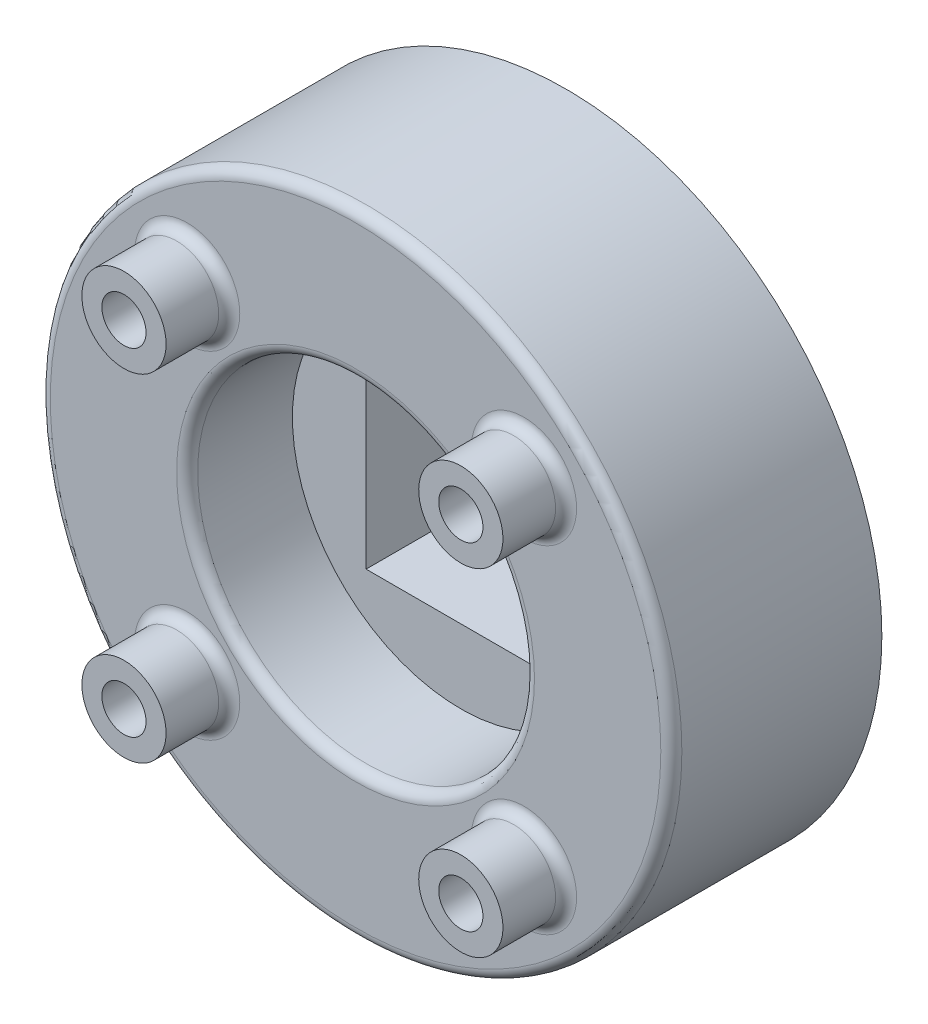
ISO-10303-21;
HEADER;
FILE_DESCRIPTION(('STEP AP214'),'2;1');
FILE_NAME('part.step','',(''),(''),'','','');
FILE_SCHEMA(('AUTOMOTIVE_DESIGN { 1 0 10303 214 1 1 1 1 }'));
ENDSEC;
DATA;
#1=APPLICATION_CONTEXT('core data for automotive mechanical design processes');
#2=APPLICATION_PROTOCOL_DEFINITION('international standard','automotive_design',2000,#1);
#3=PRODUCT_CONTEXT('',#1,'mechanical');
#4=PRODUCT('Part','Part','',(#3));
#5=PRODUCT_RELATED_PRODUCT_CATEGORY('part','',(#4));
#6=PRODUCT_DEFINITION_FORMATION('','',#4);
#7=PRODUCT_DEFINITION_CONTEXT('part definition',#1,'design');
#8=PRODUCT_DEFINITION('design','',#6,#7);
#9=PRODUCT_DEFINITION_SHAPE('','',#8);
#10=(LENGTH_UNIT() NAMED_UNIT(*) SI_UNIT(.MILLI.,.METRE.));
#11=(NAMED_UNIT(*) PLANE_ANGLE_UNIT() SI_UNIT($,.RADIAN.));
#12=(NAMED_UNIT(*) SI_UNIT($,.STERADIAN.) SOLID_ANGLE_UNIT());
#13=UNCERTAINTY_MEASURE_WITH_UNIT(LENGTH_MEASURE(1.E-05),#10,'distance_accuracy_value','');
#14=(GEOMETRIC_REPRESENTATION_CONTEXT(3) GLOBAL_UNCERTAINTY_ASSIGNED_CONTEXT((#13)) GLOBAL_UNIT_ASSIGNED_CONTEXT((#10,
#11,#12)) REPRESENTATION_CONTEXT('',''));
#15=CARTESIAN_POINT('',(0.,0.,0.));
#16=DIRECTION('',(0.,0.,1.));
#17=DIRECTION('',(1.,0.,0.));
#18=AXIS2_PLACEMENT_3D('',#15,#16,#17);
#19=CARTESIAN_POINT('',(0.,0.,50.));
#20=DIRECTION('',(0.,0.,-1.));
#21=DIRECTION('',(-1.,0.,0.));
#22=AXIS2_PLACEMENT_3D('',#19,#20,#21);
#23=CYLINDRICAL_SURFACE('',#22,75.);
#24=CARTESIAN_POINT('',(0.,0.,47.5));
#25=DIRECTION('',(0.,0.,1.));
#26=DIRECTION('',(1.,0.,0.));
#27=AXIS2_PLACEMENT_3D('',#24,#25,#26);
#28=CIRCLE('',#27,75.);
#29=CARTESIAN_POINT('',(75.,0.,47.5));
#30=VERTEX_POINT('',#29);
#31=EDGE_CURVE('E11',#30,#30,#28,.F.);
#32=ORIENTED_EDGE('',*,*,#31,.T.);
#33=EDGE_LOOP('',(#32));
#34=FACE_BOUND('',#33,.T.);
#35=CARTESIAN_POINT('',(0.,0.,0.));
#36=DIRECTION('',(0.,0.,1.));
#37=DIRECTION('',(1.,0.,0.));
#38=AXIS2_PLACEMENT_3D('',#35,#36,#37);
#39=CIRCLE('',#38,75.);
#40=CARTESIAN_POINT('',(75.,0.,0.));
#41=VERTEX_POINT('',#40);
#42=EDGE_CURVE('E162',#41,#41,#39,.T.);
#43=ORIENTED_EDGE('',*,*,#42,.T.);
#44=EDGE_LOOP('',(#43));
#45=FACE_BOUND('',#44,.T.);
#46=ADVANCED_FACE('F36',(#34,#45),#23,.T.);
#47=CARTESIAN_POINT('',(0.,0.,50.));
#48=DIRECTION('',(0.,0.,1.));
#49=DIRECTION('',(1.,0.,0.));
#50=AXIS2_PLACEMENT_3D('',#47,#48,#49);
#51=PLANE('',#50);
#52=CARTESIAN_POINT('',(0.,0.,50.));
#53=DIRECTION('',(0.,0.,1.));
#54=DIRECTION('',(1.,0.,0.));
#55=AXIS2_PLACEMENT_3D('',#52,#53,#54);
#56=CIRCLE('',#55,42.5);
#57=CARTESIAN_POINT('',(42.5,0.,50.));
#58=VERTEX_POINT('',#57);
#59=EDGE_CURVE('E44',#58,#58,#56,.F.);
#60=ORIENTED_EDGE('',*,*,#59,.T.);
#61=EDGE_LOOP('',(#60));
#62=FACE_BOUND('',#61,.T.);
#63=CARTESIAN_POINT('',(0.,0.,50.));
#64=DIRECTION('',(0.,0.,1.));
#65=DIRECTION('',(1.,0.,0.));
#66=AXIS2_PLACEMENT_3D('',#63,#64,#65);
#67=CIRCLE('',#66,72.5);
#68=CARTESIAN_POINT('',(72.5,0.,50.));
#69=VERTEX_POINT('',#68);
#70=EDGE_CURVE('E192',#69,#69,#67,.T.);
#71=ORIENTED_EDGE('',*,*,#70,.T.);
#72=EDGE_LOOP('',(#71));
#73=FACE_BOUND('',#72,.T.);
#74=CARTESIAN_POINT('',(39.9999999999996,40.0000000000004,50.));
#75=DIRECTION('',(0.,0.,1.));
#76=DIRECTION('',(1.,0.,0.));
#77=AXIS2_PLACEMENT_3D('',#74,#75,#76);
#78=CIRCLE('',#77,12.5);
#79=CARTESIAN_POINT('',(52.4999999999996,40.0000000000004,50.));
#80=VERTEX_POINT('',#79);
#81=EDGE_CURVE('E186',#80,#80,#78,.F.);
#82=ORIENTED_EDGE('',*,*,#81,.T.);
#83=EDGE_LOOP('',(#82));
#84=FACE_BOUND('',#83,.T.);
#85=CARTESIAN_POINT('',(40.,-40.,50.));
#86=DIRECTION('',(0.,0.,1.));
#87=DIRECTION('',(1.,0.,0.));
#88=AXIS2_PLACEMENT_3D('',#85,#86,#87);
#89=CIRCLE('',#88,12.5);
#90=CARTESIAN_POINT('',(52.5,-40.,50.));
#91=VERTEX_POINT('',#90);
#92=EDGE_CURVE('E180',#91,#91,#89,.F.);
#93=ORIENTED_EDGE('',*,*,#92,.T.);
#94=EDGE_LOOP('',(#93));
#95=FACE_BOUND('',#94,.T.);
#96=CARTESIAN_POINT('',(-39.9999999999999,-40.0000000000001,50.));
#97=DIRECTION('',(0.,0.,1.));
#98=DIRECTION('',(1.,0.,0.));
#99=AXIS2_PLACEMENT_3D('',#96,#97,#98);
#100=CIRCLE('',#99,12.5);
#101=CARTESIAN_POINT('',(-27.4999999999999,-40.0000000000001,50.));
#102=VERTEX_POINT('',#101);
#103=EDGE_CURVE('E174',#102,#102,#100,.F.);
#104=ORIENTED_EDGE('',*,*,#103,.T.);
#105=EDGE_LOOP('',(#104));
#106=FACE_BOUND('',#105,.T.);
#107=CARTESIAN_POINT('',(-40.,40.,50.));
#108=DIRECTION('',(0.,0.,1.));
#109=DIRECTION('',(1.,0.,0.));
#110=AXIS2_PLACEMENT_3D('',#107,#108,#109);
#111=CIRCLE('',#110,12.5);
#112=CARTESIAN_POINT('',(-27.5,40.,50.));
#113=VERTEX_POINT('',#112);
#114=EDGE_CURVE('E168',#113,#113,#111,.F.);
#115=ORIENTED_EDGE('',*,*,#114,.T.);
#116=EDGE_LOOP('',(#115));
#117=FACE_BOUND('',#116,.T.);
#118=ADVANCED_FACE('F197',(#62,#73,#84,#95,#106,#117),#51,.T.);
#119=CARTESIAN_POINT('',(0.,0.,0.));
#120=DIRECTION('',(0.,0.,1.));
#121=DIRECTION('',(1.,0.,0.));
#122=AXIS2_PLACEMENT_3D('',#119,#120,#121);
#123=PLANE('',#122);
#124=DIRECTION('',(-1.,0.,0.));
#125=VECTOR('',#124,1.);
#126=CARTESIAN_POINT('',(22.5,22.5,0.));
#127=LINE('',#126,#125);
#128=CARTESIAN_POINT('',(22.5,22.5,0.));
#129=VERTEX_POINT('',#128);
#130=CARTESIAN_POINT('',(-22.5,22.5,0.));
#131=VERTEX_POINT('',#130);
#132=EDGE_CURVE('E140',#129,#131,#127,.T.);
#133=ORIENTED_EDGE('',*,*,#132,.T.);
#134=DIRECTION('',(0.,-1.,0.));
#135=VECTOR('',#134,1.);
#136=CARTESIAN_POINT('',(-22.5,-22.5,0.));
#137=LINE('',#136,#135);
#138=CARTESIAN_POINT('',(-22.5,-22.5,0.));
#139=VERTEX_POINT('',#138);
#140=EDGE_CURVE('E132',#131,#139,#137,.T.);
#141=ORIENTED_EDGE('',*,*,#140,.T.);
#142=DIRECTION('',(1.,0.,0.));
#143=VECTOR('',#142,1.);
#144=CARTESIAN_POINT('',(22.5,-22.5,0.));
#145=LINE('',#144,#143);
#146=CARTESIAN_POINT('',(22.5,-22.5,0.));
#147=VERTEX_POINT('',#146);
#148=EDGE_CURVE('E135',#139,#147,#145,.T.);
#149=ORIENTED_EDGE('',*,*,#148,.T.);
#150=DIRECTION('',(0.,1.,0.));
#151=VECTOR('',#150,1.);
#152=CARTESIAN_POINT('',(22.5,-22.5,0.));
#153=LINE('',#152,#151);
#154=EDGE_CURVE('E56',#147,#129,#153,.T.);
#155=ORIENTED_EDGE('',*,*,#154,.T.);
#156=EDGE_LOOP('',(#133,#141,#149,#155));
#157=FACE_BOUND('',#156,.T.);
#158=ORIENTED_EDGE('',*,*,#42,.F.);
#159=EDGE_LOOP('',(#158));
#160=FACE_BOUND('',#159,.T.);
#161=ADVANCED_FACE('F209',(#157,#160),#123,.F.);
#162=CARTESIAN_POINT('',(0.,0.,25.));
#163=DIRECTION('',(0.,0.,1.));
#164=DIRECTION('',(1.,0.,0.));
#165=AXIS2_PLACEMENT_3D('',#162,#163,#164);
#166=CYLINDRICAL_SURFACE('',#165,40.);
#167=CARTESIAN_POINT('',(0.,0.,47.5));
#168=DIRECTION('',(0.,0.,1.));
#169=DIRECTION('',(1.,0.,0.));
#170=AXIS2_PLACEMENT_3D('',#167,#168,#169);
#171=CIRCLE('',#170,40.);
#172=CARTESIAN_POINT('',(40.,0.,47.5));
#173=VERTEX_POINT('',#172);
#174=EDGE_CURVE('E189',#173,#173,#171,.T.);
#175=ORIENTED_EDGE('',*,*,#174,.T.);
#176=EDGE_LOOP('',(#175));
#177=FACE_BOUND('',#176,.T.);
#178=CARTESIAN_POINT('',(0.,0.,25.));
#179=DIRECTION('',(0.,0.,1.));
#180=DIRECTION('',(1.,0.,0.));
#181=AXIS2_PLACEMENT_3D('',#178,#179,#180);
#182=CIRCLE('',#181,40.);
#183=CARTESIAN_POINT('',(40.,0.,25.));
#184=VERTEX_POINT('',#183);
#185=EDGE_CURVE('E154',#184,#184,#182,.T.);
#186=ORIENTED_EDGE('',*,*,#185,.F.);
#187=EDGE_LOOP('',(#186));
#188=FACE_BOUND('',#187,.T.);
#189=ADVANCED_FACE('F205',(#177,#188),#166,.F.);
#190=CARTESIAN_POINT('',(0.,0.,25.));
#191=DIRECTION('',(0.,0.,1.));
#192=DIRECTION('',(1.,0.,0.));
#193=AXIS2_PLACEMENT_3D('',#190,#191,#192);
#194=PLANE('',#193);
#195=DIRECTION('',(0.,-1.,0.));
#196=VECTOR('',#195,1.);
#197=CARTESIAN_POINT('',(-22.5,-22.5,25.));
#198=LINE('',#197,#196);
#199=CARTESIAN_POINT('',(-22.5,22.5,25.));
#200=VERTEX_POINT('',#199);
#201=CARTESIAN_POINT('',(-22.5,-22.5,25.));
#202=VERTEX_POINT('',#201);
#203=EDGE_CURVE('E131',#200,#202,#198,.T.);
#204=ORIENTED_EDGE('',*,*,#203,.F.);
#205=DIRECTION('',(-1.,0.,0.));
#206=VECTOR('',#205,1.);
#207=CARTESIAN_POINT('',(22.5,22.5,25.));
#208=LINE('',#207,#206);
#209=CARTESIAN_POINT('',(22.5,22.5,25.));
#210=VERTEX_POINT('',#209);
#211=EDGE_CURVE('E136',#210,#200,#208,.T.);
#212=ORIENTED_EDGE('',*,*,#211,.F.);
#213=DIRECTION('',(0.,1.,0.));
#214=VECTOR('',#213,1.);
#215=CARTESIAN_POINT('',(22.5,-22.5,25.));
#216=LINE('',#215,#214);
#217=CARTESIAN_POINT('',(22.5,-22.5,25.));
#218=VERTEX_POINT('',#217);
#219=EDGE_CURVE('E51',#218,#210,#216,.T.);
#220=ORIENTED_EDGE('',*,*,#219,.F.);
#221=DIRECTION('',(1.,0.,0.));
#222=VECTOR('',#221,1.);
#223=CARTESIAN_POINT('',(22.5,-22.5,25.));
#224=LINE('',#223,#222);
#225=EDGE_CURVE('E146',#202,#218,#224,.T.);
#226=ORIENTED_EDGE('',*,*,#225,.F.);
#227=EDGE_LOOP('',(#204,#212,#220,#226));
#228=FACE_BOUND('',#227,.T.);
#229=ORIENTED_EDGE('',*,*,#185,.T.);
#230=EDGE_LOOP('',(#229));
#231=FACE_BOUND('',#230,.T.);
#232=ADVANCED_FACE('F208',(#228,#231),#194,.T.);
#233=CARTESIAN_POINT('',(-22.5,-22.5,0.));
#234=DIRECTION('',(-1.,0.,0.));
#235=DIRECTION('',(0.,0.,1.));
#236=AXIS2_PLACEMENT_3D('',#233,#234,#235);
#237=PLANE('',#236);
#238=ORIENTED_EDGE('',*,*,#203,.T.);
#239=DIRECTION('',(0.,0.,1.));
#240=VECTOR('',#239,1.);
#241=CARTESIAN_POINT('',(-22.5,-22.5,0.));
#242=LINE('',#241,#240);
#243=EDGE_CURVE('E143',#139,#202,#242,.T.);
#244=ORIENTED_EDGE('',*,*,#243,.F.);
#245=ORIENTED_EDGE('',*,*,#140,.F.);
#246=DIRECTION('',(0.,0.,1.));
#247=VECTOR('',#246,1.);
#248=CARTESIAN_POINT('',(-22.5,22.5,0.));
#249=LINE('',#248,#247);
#250=EDGE_CURVE('E152',#131,#200,#249,.T.);
#251=ORIENTED_EDGE('',*,*,#250,.T.);
#252=EDGE_LOOP('',(#238,#244,#245,#251));
#253=FACE_BOUND('',#252,.T.);
#254=ADVANCED_FACE('F214',(#253),#237,.F.);
#255=CARTESIAN_POINT('',(22.5,22.5,0.));
#256=DIRECTION('',(0.,1.,0.));
#257=DIRECTION('',(-1.,0.,0.));
#258=AXIS2_PLACEMENT_3D('',#255,#256,#257);
#259=PLANE('',#258);
#260=ORIENTED_EDGE('',*,*,#211,.T.);
#261=ORIENTED_EDGE('',*,*,#250,.F.);
#262=ORIENTED_EDGE('',*,*,#132,.F.);
#263=DIRECTION('',(0.,0.,1.));
#264=VECTOR('',#263,1.);
#265=CARTESIAN_POINT('',(22.5,22.5,0.));
#266=LINE('',#265,#264);
#267=EDGE_CURVE('E155',#129,#210,#266,.T.);
#268=ORIENTED_EDGE('',*,*,#267,.T.);
#269=EDGE_LOOP('',(#260,#261,#262,#268));
#270=FACE_BOUND('',#269,.T.);
#271=ADVANCED_FACE('F220',(#270),#259,.F.);
#272=CARTESIAN_POINT('',(22.5,-22.5,0.));
#273=DIRECTION('',(1.,0.,0.));
#274=DIRECTION('',(0.,0.,-1.));
#275=AXIS2_PLACEMENT_3D('',#272,#273,#274);
#276=PLANE('',#275);
#277=ORIENTED_EDGE('',*,*,#219,.T.);
#278=ORIENTED_EDGE('',*,*,#267,.F.);
#279=ORIENTED_EDGE('',*,*,#154,.F.);
#280=DIRECTION('',(0.,0.,1.));
#281=VECTOR('',#280,1.);
#282=CARTESIAN_POINT('',(22.5,-22.5,0.));
#283=LINE('',#282,#281);
#284=EDGE_CURVE('E157',#147,#218,#283,.T.);
#285=ORIENTED_EDGE('',*,*,#284,.T.);
#286=EDGE_LOOP('',(#277,#278,#279,#285));
#287=FACE_BOUND('',#286,.T.);
#288=ADVANCED_FACE('F310',(#287),#276,.F.);
#289=CARTESIAN_POINT('',(22.5,-22.5,0.));
#290=DIRECTION('',(0.,-1.,0.));
#291=DIRECTION('',(1.,0.,0.));
#292=AXIS2_PLACEMENT_3D('',#289,#290,#291);
#293=PLANE('',#292);
#294=ORIENTED_EDGE('',*,*,#225,.T.);
#295=ORIENTED_EDGE('',*,*,#284,.F.);
#296=ORIENTED_EDGE('',*,*,#148,.F.);
#297=ORIENTED_EDGE('',*,*,#243,.T.);
#298=EDGE_LOOP('',(#294,#295,#296,#297));
#299=FACE_BOUND('',#298,.T.);
#300=ADVANCED_FACE('F306',(#299),#293,.F.);
#301=CARTESIAN_POINT('',(-40.,40.,65.));
#302=DIRECTION('',(0.,0.,-1.));
#303=DIRECTION('',(-1.,0.,0.));
#304=AXIS2_PLACEMENT_3D('',#301,#302,#303);
#305=CYLINDRICAL_SURFACE('',#304,10.);
#306=CARTESIAN_POINT('',(-40.,40.,52.5));
#307=DIRECTION('',(0.,0.,1.));
#308=DIRECTION('',(1.,0.,0.));
#309=AXIS2_PLACEMENT_3D('',#306,#307,#308);
#310=CIRCLE('',#309,10.);
#311=CARTESIAN_POINT('',(-30.,40.,52.5));
#312=VERTEX_POINT('',#311);
#313=EDGE_CURVE('E165',#312,#312,#310,.T.);
#314=ORIENTED_EDGE('',*,*,#313,.T.);
#315=EDGE_LOOP('',(#314));
#316=FACE_BOUND('',#315,.T.);
#317=CARTESIAN_POINT('',(-40.,40.,65.));
#318=DIRECTION('',(0.,0.,1.));
#319=DIRECTION('',(1.,0.,0.));
#320=AXIS2_PLACEMENT_3D('',#317,#318,#319);
#321=CIRCLE('',#320,10.);
#322=CARTESIAN_POINT('',(-30.,40.,65.));
#323=VERTEX_POINT('',#322);
#324=EDGE_CURVE('E128',#323,#323,#321,.T.);
#325=ORIENTED_EDGE('',*,*,#324,.F.);
#326=EDGE_LOOP('',(#325));
#327=FACE_BOUND('',#326,.T.);
#328=ADVANCED_FACE('F302',(#316,#327),#305,.T.);
#329=CARTESIAN_POINT('',(-40.,40.,65.));
#330=DIRECTION('',(0.,0.,1.));
#331=DIRECTION('',(1.,0.,0.));
#332=AXIS2_PLACEMENT_3D('',#329,#330,#331);
#333=PLANE('',#332);
#334=CARTESIAN_POINT('',(-40.,40.,65.));
#335=DIRECTION('',(0.,0.,1.));
#336=DIRECTION('',(1.,0.,0.));
#337=AXIS2_PLACEMENT_3D('',#334,#335,#336);
#338=CIRCLE('',#337,5.25);
#339=CARTESIAN_POINT('',(-34.75,40.,65.));
#340=VERTEX_POINT('',#339);
#341=EDGE_CURVE('E122',#340,#340,#338,.T.);
#342=ORIENTED_EDGE('',*,*,#341,.F.);
#343=EDGE_LOOP('',(#342));
#344=FACE_BOUND('',#343,.T.);
#345=ORIENTED_EDGE('',*,*,#324,.T.);
#346=EDGE_LOOP('',(#345));
#347=FACE_BOUND('',#346,.T.);
#348=ADVANCED_FACE('F238',(#344,#347),#333,.T.);
#349=CARTESIAN_POINT('',(-40.,40.,52.5));
#350=DIRECTION('',(0.,0.,1.));
#351=DIRECTION('',(1.,0.,0.));
#352=AXIS2_PLACEMENT_3D('',#349,#350,#351);
#353=TOROIDAL_SURFACE('',#352,12.5,2.5);
#354=ORIENTED_EDGE('',*,*,#114,.F.);
#355=EDGE_LOOP('',(#354));
#356=FACE_BOUND('',#355,.T.);
#357=ORIENTED_EDGE('',*,*,#313,.F.);
#358=EDGE_LOOP('',(#357));
#359=FACE_BOUND('',#358,.T.);
#360=ADVANCED_FACE('F234',(#356,#359),#353,.F.);
#361=CARTESIAN_POINT('',(-40.,40.,33.5));
#362=DIRECTION('',(0.,0.,1.));
#363=DIRECTION('',(1.,0.,0.));
#364=AXIS2_PLACEMENT_3D('',#361,#362,#363);
#365=CONICAL_SURFACE('',#364,5.25,1.02974425867665);
#366=CARTESIAN_POINT('',(-40.,40.,30.3454817501053));
#367=VERTEX_POINT('',#366);
#368=VERTEX_LOOP('',#367);
#369=FACE_BOUND('',#368,.T.);
#370=CARTESIAN_POINT('',(-40.,40.,33.5));
#371=DIRECTION('',(0.,0.,1.));
#372=DIRECTION('',(1.,0.,0.));
#373=AXIS2_PLACEMENT_3D('',#370,#371,#372);
#374=CIRCLE('',#373,5.25);
#375=CARTESIAN_POINT('',(-34.75,40.,33.5));
#376=VERTEX_POINT('',#375);
#377=EDGE_CURVE('E125',#376,#376,#374,.T.);
#378=ORIENTED_EDGE('',*,*,#377,.T.);
#379=EDGE_LOOP('',(#378));
#380=FACE_BOUND('',#379,.T.);
#381=ADVANCED_FACE('F237',(#369,#380),#365,.F.);
#382=CARTESIAN_POINT('',(-40.,40.,65.));
#383=DIRECTION('',(0.,0.,1.));
#384=DIRECTION('',(1.,0.,0.));
#385=AXIS2_PLACEMENT_3D('',#382,#383,#384);
#386=CYLINDRICAL_SURFACE('',#385,5.25);
#387=ORIENTED_EDGE('',*,*,#377,.F.);
#388=EDGE_LOOP('',(#387));
#389=FACE_BOUND('',#388,.T.);
#390=ORIENTED_EDGE('',*,*,#341,.T.);
#391=EDGE_LOOP('',(#390));
#392=FACE_BOUND('',#391,.T.);
#393=ADVANCED_FACE('F292',(#389,#392),#386,.F.);
#394=CARTESIAN_POINT('',(-39.9999999999999,-40.0000000000001,65.));
#395=DIRECTION('',(0.,0.,-1.));
#396=DIRECTION('',(-1.,0.,0.));
#397=AXIS2_PLACEMENT_3D('',#394,#395,#396);
#398=CYLINDRICAL_SURFACE('',#397,10.);
#399=CARTESIAN_POINT('',(-39.9999999999999,-40.0000000000001,52.5));
#400=DIRECTION('',(0.,0.,1.));
#401=DIRECTION('',(1.,0.,0.));
#402=AXIS2_PLACEMENT_3D('',#399,#400,#401);
#403=CIRCLE('',#402,10.);
#404=CARTESIAN_POINT('',(-29.9999999999999,-40.0000000000001,52.5));
#405=VERTEX_POINT('',#404);
#406=EDGE_CURVE('E171',#405,#405,#403,.T.);
#407=ORIENTED_EDGE('',*,*,#406,.T.);
#408=EDGE_LOOP('',(#407));
#409=FACE_BOUND('',#408,.T.);
#410=CARTESIAN_POINT('',(-39.9999999999999,-40.0000000000001,65.));
#411=DIRECTION('',(0.,0.,1.));
#412=DIRECTION('',(0.,1.,0.));
#413=AXIS2_PLACEMENT_3D('',#410,#411,#412);
#414=CIRCLE('',#413,10.);
#415=CARTESIAN_POINT('',(-39.9999999999999,-30.0000000000001,65.));
#416=VERTEX_POINT('',#415);
#417=EDGE_CURVE('E119',#416,#416,#414,.T.);
#418=ORIENTED_EDGE('',*,*,#417,.F.);
#419=EDGE_LOOP('',(#418));
#420=FACE_BOUND('',#419,.T.);
#421=ADVANCED_FACE('F288',(#409,#420),#398,.T.);
#422=CARTESIAN_POINT('',(-39.9999999999999,-40.0000000000001,65.));
#423=DIRECTION('',(0.,0.,1.));
#424=DIRECTION('',(0.,1.,0.));
#425=AXIS2_PLACEMENT_3D('',#422,#423,#424);
#426=PLANE('',#425);
#427=CARTESIAN_POINT('',(-39.9999999999999,-40.0000000000001,65.));
#428=DIRECTION('',(0.,0.,1.));
#429=DIRECTION('',(1.,0.,0.));
#430=AXIS2_PLACEMENT_3D('',#427,#428,#429);
#431=CIRCLE('',#430,5.25);
#432=CARTESIAN_POINT('',(-34.7499999999999,-40.0000000000001,65.));
#433=VERTEX_POINT('',#432);
#434=EDGE_CURVE('E107',#433,#433,#431,.T.);
#435=ORIENTED_EDGE('',*,*,#434,.F.);
#436=EDGE_LOOP('',(#435));
#437=FACE_BOUND('',#436,.T.);
#438=ORIENTED_EDGE('',*,*,#417,.T.);
#439=EDGE_LOOP('',(#438));
#440=FACE_BOUND('',#439,.T.);
#441=ADVANCED_FACE('F284',(#437,#440),#426,.T.);
#442=CARTESIAN_POINT('',(40.,-40.,65.));
#443=DIRECTION('',(0.,0.,-1.));
#444=DIRECTION('',(-1.,0.,0.));
#445=AXIS2_PLACEMENT_3D('',#442,#443,#444);
#446=CYLINDRICAL_SURFACE('',#445,10.);
#447=CARTESIAN_POINT('',(40.,-40.,52.5));
#448=DIRECTION('',(0.,0.,1.));
#449=DIRECTION('',(1.,0.,0.));
#450=AXIS2_PLACEMENT_3D('',#447,#448,#449);
#451=CIRCLE('',#450,10.);
#452=CARTESIAN_POINT('',(50.,-40.,52.5));
#453=VERTEX_POINT('',#452);
#454=EDGE_CURVE('E177',#453,#453,#451,.T.);
#455=ORIENTED_EDGE('',*,*,#454,.T.);
#456=EDGE_LOOP('',(#455));
#457=FACE_BOUND('',#456,.T.);
#458=CARTESIAN_POINT('',(40.,-40.,65.));
#459=DIRECTION('',(0.,0.,1.));
#460=DIRECTION('',(-1.,0.,0.));
#461=AXIS2_PLACEMENT_3D('',#458,#459,#460);
#462=CIRCLE('',#461,10.);
#463=CARTESIAN_POINT('',(30.,-40.,65.));
#464=VERTEX_POINT('',#463);
#465=EDGE_CURVE('E116',#464,#464,#462,.T.);
#466=ORIENTED_EDGE('',*,*,#465,.F.);
#467=EDGE_LOOP('',(#466));
#468=FACE_BOUND('',#467,.T.);
#469=ADVANCED_FACE('F280',(#457,#468),#446,.T.);
#470=CARTESIAN_POINT('',(40.,-40.,65.));
#471=DIRECTION('',(0.,0.,1.));
#472=DIRECTION('',(-1.,0.,0.));
#473=AXIS2_PLACEMENT_3D('',#470,#471,#472);
#474=PLANE('',#473);
#475=CARTESIAN_POINT('',(40.,-40.,65.));
#476=DIRECTION('',(0.,0.,1.));
#477=DIRECTION('',(1.,0.,0.));
#478=AXIS2_PLACEMENT_3D('',#475,#476,#477);
#479=CIRCLE('',#478,5.25);
#480=CARTESIAN_POINT('',(45.25,-40.,65.));
#481=VERTEX_POINT('',#480);
#482=EDGE_CURVE('E96',#481,#481,#479,.T.);
#483=ORIENTED_EDGE('',*,*,#482,.F.);
#484=EDGE_LOOP('',(#483));
#485=FACE_BOUND('',#484,.T.);
#486=ORIENTED_EDGE('',*,*,#465,.T.);
#487=EDGE_LOOP('',(#486));
#488=FACE_BOUND('',#487,.T.);
#489=ADVANCED_FACE('F266',(#485,#488),#474,.T.);
#490=CARTESIAN_POINT('',(39.9999999999996,40.0000000000004,65.));
#491=DIRECTION('',(0.,0.,-1.));
#492=DIRECTION('',(-1.,0.,0.));
#493=AXIS2_PLACEMENT_3D('',#490,#491,#492);
#494=CYLINDRICAL_SURFACE('',#493,10.);
#495=CARTESIAN_POINT('',(39.9999999999996,40.0000000000004,52.5));
#496=DIRECTION('',(0.,0.,1.));
#497=DIRECTION('',(1.,0.,0.));
#498=AXIS2_PLACEMENT_3D('',#495,#496,#497);
#499=CIRCLE('',#498,10.);
#500=CARTESIAN_POINT('',(49.9999999999996,40.0000000000004,52.5));
#501=VERTEX_POINT('',#500);
#502=EDGE_CURVE('E183',#501,#501,#499,.T.);
#503=ORIENTED_EDGE('',*,*,#502,.T.);
#504=EDGE_LOOP('',(#503));
#505=FACE_BOUND('',#504,.T.);
#506=CARTESIAN_POINT('',(39.9999999999996,40.0000000000004,65.));
#507=DIRECTION('',(0.,0.,1.));
#508=DIRECTION('',(0.,-1.,0.));
#509=AXIS2_PLACEMENT_3D('',#506,#507,#508);
#510=CIRCLE('',#509,10.);
#511=CARTESIAN_POINT('',(39.9999999999997,30.0000000000004,65.));
#512=VERTEX_POINT('',#511);
#513=EDGE_CURVE('E113',#512,#512,#510,.T.);
#514=ORIENTED_EDGE('',*,*,#513,.F.);
#515=EDGE_LOOP('',(#514));
#516=FACE_BOUND('',#515,.T.);
#517=ADVANCED_FACE('F263',(#505,#516),#494,.T.);
#518=CARTESIAN_POINT('',(39.9999999999996,40.0000000000004,65.));
#519=DIRECTION('',(0.,0.,1.));
#520=DIRECTION('',(0.,-1.,0.));
#521=AXIS2_PLACEMENT_3D('',#518,#519,#520);
#522=PLANE('',#521);
#523=CARTESIAN_POINT('',(39.9999999999996,40.0000000000004,65.));
#524=DIRECTION('',(0.,0.,1.));
#525=DIRECTION('',(1.,0.,0.));
#526=AXIS2_PLACEMENT_3D('',#523,#524,#525);
#527=CIRCLE('',#526,5.25);
#528=CARTESIAN_POINT('',(45.2499999999996,40.0000000000004,65.));
#529=VERTEX_POINT('',#528);
#530=EDGE_CURVE('E97',#529,#529,#527,.T.);
#531=ORIENTED_EDGE('',*,*,#530,.F.);
#532=EDGE_LOOP('',(#531));
#533=FACE_BOUND('',#532,.T.);
#534=ORIENTED_EDGE('',*,*,#513,.T.);
#535=EDGE_LOOP('',(#534));
#536=FACE_BOUND('',#535,.T.);
#537=ADVANCED_FACE('F244',(#533,#536),#522,.T.);
#538=CARTESIAN_POINT('',(-39.9999999999999,-40.0000000000001,52.5));
#539=DIRECTION('',(0.,0.,1.));
#540=DIRECTION('',(1.,0.,0.));
#541=AXIS2_PLACEMENT_3D('',#538,#539,#540);
#542=TOROIDAL_SURFACE('',#541,12.5,2.5);
#543=ORIENTED_EDGE('',*,*,#103,.F.);
#544=EDGE_LOOP('',(#543));
#545=FACE_BOUND('',#544,.T.);
#546=ORIENTED_EDGE('',*,*,#406,.F.);
#547=EDGE_LOOP('',(#546));
#548=FACE_BOUND('',#547,.T.);
#549=ADVANCED_FACE('F240',(#545,#548),#542,.F.);
#550=CARTESIAN_POINT('',(40.,-40.,52.5));
#551=DIRECTION('',(0.,0.,1.));
#552=DIRECTION('',(1.,0.,0.));
#553=AXIS2_PLACEMENT_3D('',#550,#551,#552);
#554=TOROIDAL_SURFACE('',#553,12.5,2.5);
#555=ORIENTED_EDGE('',*,*,#92,.F.);
#556=EDGE_LOOP('',(#555));
#557=FACE_BOUND('',#556,.T.);
#558=ORIENTED_EDGE('',*,*,#454,.F.);
#559=EDGE_LOOP('',(#558));
#560=FACE_BOUND('',#559,.T.);
#561=ADVANCED_FACE('F243',(#557,#560),#554,.F.);
#562=CARTESIAN_POINT('',(39.9999999999996,40.0000000000004,52.5));
#563=DIRECTION('',(0.,0.,1.));
#564=DIRECTION('',(1.,0.,0.));
#565=AXIS2_PLACEMENT_3D('',#562,#563,#564);
#566=TOROIDAL_SURFACE('',#565,12.5,2.5);
#567=ORIENTED_EDGE('',*,*,#81,.F.);
#568=EDGE_LOOP('',(#567));
#569=FACE_BOUND('',#568,.T.);
#570=ORIENTED_EDGE('',*,*,#502,.F.);
#571=EDGE_LOOP('',(#570));
#572=FACE_BOUND('',#571,.T.);
#573=ADVANCED_FACE('F248',(#569,#572),#566,.F.);
#574=CARTESIAN_POINT('',(-39.9999999999999,-40.0000000000001,33.5));
#575=DIRECTION('',(0.,0.,1.));
#576=DIRECTION('',(1.,0.,0.));
#577=AXIS2_PLACEMENT_3D('',#574,#575,#576);
#578=CONICAL_SURFACE('',#577,5.25,1.02974425867665);
#579=CARTESIAN_POINT('',(-39.9999999999999,-40.0000000000001,30.3454817501053));
#580=VERTEX_POINT('',#579);
#581=VERTEX_LOOP('',#580);
#582=FACE_BOUND('',#581,.T.);
#583=CARTESIAN_POINT('',(-39.9999999999999,-40.0000000000001,33.5));
#584=DIRECTION('',(0.,0.,1.));
#585=DIRECTION('',(1.,0.,0.));
#586=AXIS2_PLACEMENT_3D('',#583,#584,#585);
#587=CIRCLE('',#586,5.25);
#588=CARTESIAN_POINT('',(-34.7499999999999,-40.0000000000001,33.5));
#589=VERTEX_POINT('',#588);
#590=EDGE_CURVE('E110',#589,#589,#587,.T.);
#591=ORIENTED_EDGE('',*,*,#590,.T.);
#592=EDGE_LOOP('',(#591));
#593=FACE_BOUND('',#592,.T.);
#594=ADVANCED_FACE('F251',(#582,#593),#578,.F.);
#595=CARTESIAN_POINT('',(-39.9999999999999,-40.0000000000001,65.));
#596=DIRECTION('',(0.,0.,1.));
#597=DIRECTION('',(1.,0.,0.));
#598=AXIS2_PLACEMENT_3D('',#595,#596,#597);
#599=CYLINDRICAL_SURFACE('',#598,5.25);
#600=ORIENTED_EDGE('',*,*,#590,.F.);
#601=EDGE_LOOP('',(#600));
#602=FACE_BOUND('',#601,.T.);
#603=ORIENTED_EDGE('',*,*,#434,.T.);
#604=EDGE_LOOP('',(#603));
#605=FACE_BOUND('',#604,.T.);
#606=ADVANCED_FACE('F256',(#602,#605),#599,.F.);
#607=CARTESIAN_POINT('',(40.,-40.,33.5));
#608=DIRECTION('',(0.,0.,1.));
#609=DIRECTION('',(1.,0.,0.));
#610=AXIS2_PLACEMENT_3D('',#607,#608,#609);
#611=CONICAL_SURFACE('',#610,5.25,1.02974425867665);
#612=CARTESIAN_POINT('',(40.,-40.,30.3454817501053));
#613=VERTEX_POINT('',#612);
#614=VERTEX_LOOP('',#613);
#615=FACE_BOUND('',#614,.T.);
#616=CARTESIAN_POINT('',(40.,-40.,33.5));
#617=DIRECTION('',(0.,0.,1.));
#618=DIRECTION('',(1.,0.,0.));
#619=AXIS2_PLACEMENT_3D('',#616,#617,#618);
#620=CIRCLE('',#619,5.25);
#621=CARTESIAN_POINT('',(45.25,-40.,33.5));
#622=VERTEX_POINT('',#621);
#623=EDGE_CURVE('E100',#622,#622,#620,.T.);
#624=ORIENTED_EDGE('',*,*,#623,.T.);
#625=EDGE_LOOP('',(#624));
#626=FACE_BOUND('',#625,.T.);
#627=ADVANCED_FACE('F398',(#615,#626),#611,.F.);
#628=CARTESIAN_POINT('',(40.,-40.,65.));
#629=DIRECTION('',(0.,0.,1.));
#630=DIRECTION('',(1.,0.,0.));
#631=AXIS2_PLACEMENT_3D('',#628,#629,#630);
#632=CYLINDRICAL_SURFACE('',#631,5.25);
#633=ORIENTED_EDGE('',*,*,#623,.F.);
#634=EDGE_LOOP('',(#633));
#635=FACE_BOUND('',#634,.T.);
#636=ORIENTED_EDGE('',*,*,#482,.T.);
#637=EDGE_LOOP('',(#636));
#638=FACE_BOUND('',#637,.T.);
#639=ADVANCED_FACE('F90',(#635,#638),#632,.F.);
#640=CARTESIAN_POINT('',(39.9999999999996,40.0000000000004,33.5));
#641=DIRECTION('',(0.,0.,1.));
#642=DIRECTION('',(1.,0.,0.));
#643=AXIS2_PLACEMENT_3D('',#640,#641,#642);
#644=CONICAL_SURFACE('',#643,5.25,1.02974425867665);
#645=CARTESIAN_POINT('',(39.9999999999996,40.0000000000004,30.3454817501053));
#646=VERTEX_POINT('',#645);
#647=VERTEX_LOOP('',#646);
#648=FACE_BOUND('',#647,.T.);
#649=CARTESIAN_POINT('',(39.9999999999996,40.0000000000004,33.5));
#650=DIRECTION('',(0.,0.,1.));
#651=DIRECTION('',(1.,0.,0.));
#652=AXIS2_PLACEMENT_3D('',#649,#650,#651);
#653=CIRCLE('',#652,5.25);
#654=CARTESIAN_POINT('',(45.2499999999996,40.0000000000004,33.5));
#655=VERTEX_POINT('',#654);
#656=EDGE_CURVE('E94',#655,#655,#653,.T.);
#657=ORIENTED_EDGE('',*,*,#656,.T.);
#658=EDGE_LOOP('',(#657));
#659=FACE_BOUND('',#658,.T.);
#660=ADVANCED_FACE('F86',(#648,#659),#644,.F.);
#661=CARTESIAN_POINT('',(39.9999999999996,40.0000000000004,65.));
#662=DIRECTION('',(0.,0.,1.));
#663=DIRECTION('',(1.,0.,0.));
#664=AXIS2_PLACEMENT_3D('',#661,#662,#663);
#665=CYLINDRICAL_SURFACE('',#664,5.25);
#666=ORIENTED_EDGE('',*,*,#656,.F.);
#667=EDGE_LOOP('',(#666));
#668=FACE_BOUND('',#667,.T.);
#669=ORIENTED_EDGE('',*,*,#530,.T.);
#670=EDGE_LOOP('',(#669));
#671=FACE_BOUND('',#670,.T.);
#672=ADVANCED_FACE('F89',(#668,#671),#665,.F.);
#673=CARTESIAN_POINT('',(0.,0.,47.5));
#674=DIRECTION('',(0.,0.,1.));
#675=DIRECTION('',(1.,0.,0.));
#676=AXIS2_PLACEMENT_3D('',#673,#674,#675);
#677=TOROIDAL_SURFACE('',#676,42.5,2.5);
#678=ORIENTED_EDGE('',*,*,#59,.F.);
#679=EDGE_LOOP('',(#678));
#680=FACE_BOUND('',#679,.T.);
#681=ORIENTED_EDGE('',*,*,#174,.F.);
#682=EDGE_LOOP('',(#681));
#683=FACE_BOUND('',#682,.T.);
#684=ADVANCED_FACE('F200',(#680,#683),#677,.T.);
#685=CARTESIAN_POINT('',(0.,0.,47.5));
#686=DIRECTION('',(0.,0.,1.));
#687=DIRECTION('',(1.,0.,0.));
#688=AXIS2_PLACEMENT_3D('',#685,#686,#687);
#689=TOROIDAL_SURFACE('',#688,72.5,2.5);
#690=ORIENTED_EDGE('',*,*,#31,.F.);
#691=EDGE_LOOP('',(#690));
#692=FACE_BOUND('',#691,.T.);
#693=ORIENTED_EDGE('',*,*,#70,.F.);
#694=EDGE_LOOP('',(#693));
#695=FACE_BOUND('',#694,.T.);
#696=ADVANCED_FACE('F38',(#692,#695),#689,.T.);
#697=CLOSED_SHELL('',(#46,#118,#161,#189,#232,#254,#271,#288,#300,#328,#348,#360,#381,#393,#421,
#441,#469,#489,#517,#537,#549,#561,#573,#594,#606,#627,#639,#660,#672,#684,#696));
#698=MANIFOLD_SOLID_BREP('B2',#697);
#699=ADVANCED_BREP_SHAPE_REPRESENTATION('',(#18,#698),#14);
#700=SHAPE_DEFINITION_REPRESENTATION(#9,#699);
ENDSEC;
END-ISO-10303-21;
